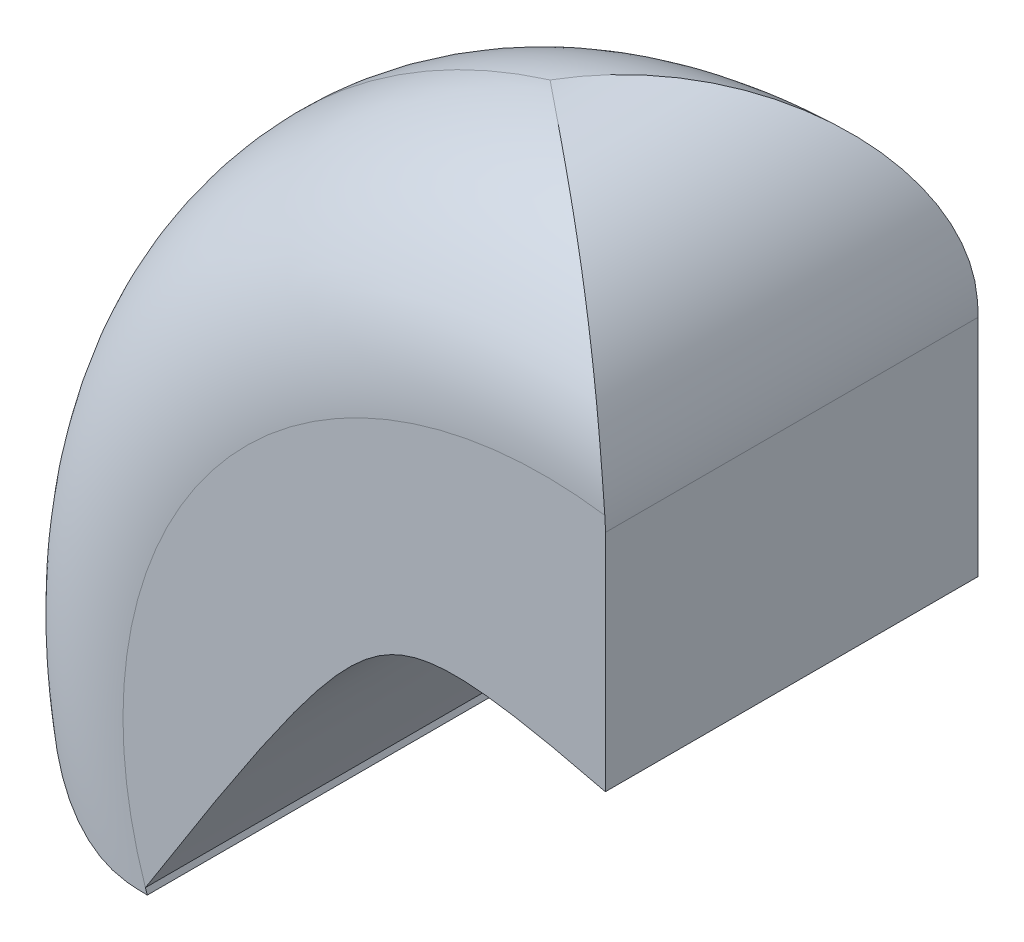
ISO-10303-21;
HEADER;
FILE_DESCRIPTION(('STEP AP214'),'2;1');
FILE_NAME('part.step','',(''),(''),'','','');
FILE_SCHEMA(('AUTOMOTIVE_DESIGN { 1 0 10303 214 1 1 1 1 }'));
ENDSEC;
DATA;
#1=APPLICATION_CONTEXT('core data for automotive mechanical design processes');
#2=APPLICATION_PROTOCOL_DEFINITION('international standard','automotive_design',2000,#1);
#3=PRODUCT_CONTEXT('',#1,'mechanical');
#4=PRODUCT('Part','Part','',(#3));
#5=PRODUCT_RELATED_PRODUCT_CATEGORY('part','',(#4));
#6=PRODUCT_DEFINITION_FORMATION('','',#4);
#7=PRODUCT_DEFINITION_CONTEXT('part definition',#1,'design');
#8=PRODUCT_DEFINITION('design','',#6,#7);
#9=PRODUCT_DEFINITION_SHAPE('','',#8);
#10=(LENGTH_UNIT() NAMED_UNIT(*) SI_UNIT(.MILLI.,.METRE.));
#11=(NAMED_UNIT(*) PLANE_ANGLE_UNIT() SI_UNIT($,.RADIAN.));
#12=(NAMED_UNIT(*) SI_UNIT($,.STERADIAN.) SOLID_ANGLE_UNIT());
#13=UNCERTAINTY_MEASURE_WITH_UNIT(LENGTH_MEASURE(1.E-05),#10,'distance_accuracy_value','');
#14=(GEOMETRIC_REPRESENTATION_CONTEXT(3) GLOBAL_UNCERTAINTY_ASSIGNED_CONTEXT((#13)) GLOBAL_UNIT_ASSIGNED_CONTEXT((#10,
#11,#12)) REPRESENTATION_CONTEXT('',''));
#15=CARTESIAN_POINT('',(0.,0.,0.));
#16=DIRECTION('',(0.,0.,1.));
#17=DIRECTION('',(1.,0.,0.));
#18=AXIS2_PLACEMENT_3D('',#15,#16,#17);
#19=CARTESIAN_POINT('',(0.,0.,4.064));
#20=DIRECTION('',(-1.,0.,0.));
#21=DIRECTION('',(0.,0.,1.));
#22=AXIS2_PLACEMENT_3D('',#19,#20,#21);
#23=PLANE('',#22);
#24=DIRECTION('',(0.,1.,0.));
#25=VECTOR('',#24,1.);
#26=CARTESIAN_POINT('',(0.,0.,4.064));
#27=LINE('',#26,#25);
#28=CARTESIAN_POINT('',(0.,3.47396540392977,4.064));
#29=VERTEX_POINT('',#28);
#30=CARTESIAN_POINT('',(0.,5.92316289736017,4.064));
#31=VERTEX_POINT('',#30);
#32=EDGE_CURVE('E117',#29,#31,#27,.T.);
#33=ORIENTED_EDGE('',*,*,#32,.F.);
#34=DIRECTION('',(0.,0.,-1.));
#35=VECTOR('',#34,1.);
#36=CARTESIAN_POINT('',(0.,3.47396540392977,4.064));
#37=LINE('',#36,#35);
#38=CARTESIAN_POINT('',(0.,3.47396540392977,0.));
#39=VERTEX_POINT('',#38);
#40=EDGE_CURVE('E272',#29,#39,#37,.T.);
#41=ORIENTED_EDGE('',*,*,#40,.T.);
#42=DIRECTION('',(0.,1.,0.));
#43=VECTOR('',#42,1.);
#44=CARTESIAN_POINT('',(0.,0.,0.));
#45=LINE('',#44,#43);
#46=CARTESIAN_POINT('',(0.,5.92316289736017,0.));
#47=VERTEX_POINT('',#46);
#48=EDGE_CURVE('E96',#39,#47,#45,.T.);
#49=ORIENTED_EDGE('',*,*,#48,.T.);
#50=DIRECTION('',(0.,0.,-1.));
#51=VECTOR('',#50,1.);
#52=CARTESIAN_POINT('',(0.,5.92316289736017,4.064));
#53=LINE('',#52,#51);
#54=EDGE_CURVE('E133',#47,#31,#53,.F.);
#55=ORIENTED_EDGE('',*,*,#54,.T.);
#56=EDGE_LOOP('',(#33,#41,#49,#55));
#57=FACE_BOUND('',#56,.T.);
#58=ADVANCED_FACE('F44',(#57),#23,.F.);
#59=CARTESIAN_POINT('',(0.,0.,4.064));
#60=DIRECTION('',(0.,1.,0.));
#61=DIRECTION('',(-1.,0.,0.));
#62=AXIS2_PLACEMENT_3D('',#59,#60,#61);
#63=PLANE('',#62);
#64=CARTESIAN_POINT('',(-5.23453439957361,0.,0.0125687678134763));
#65=CARTESIAN_POINT('',(-5.19484542475579,0.,0.00837410079089449));
#66=CARTESIAN_POINT('',(-5.15510118786411,0.,0.00522936996673769));
#67=CARTESIAN_POINT('',(-5.07550234442881,0.,0.00103978884695762));
#68=CARTESIAN_POINT('',(-5.03564773831422,0.,-5.06960004449771E-06));
#69=CARTESIAN_POINT('',(-4.99573787055482,0.,0.));
#70=B_SPLINE_CURVE_WITH_KNOTS('',3,(#64,#65,#66,#67,#68,#69),.UNSPECIFIED.,.F.,.F.,(4,2,4),(0.,
0.119605364773187,0.239210265256003),.UNSPECIFIED.);
#71=CARTESIAN_POINT('',(-5.23453439957361,0.,0.0125687678134763));
#72=VERTEX_POINT('',#71);
#73=CARTESIAN_POINT('',(-4.99573787055482,0.,0.));
#74=VERTEX_POINT('',#73);
#75=EDGE_CURVE('E122',#72,#74,#70,.T.);
#76=ORIENTED_EDGE('',*,*,#75,.T.);
#77=DIRECTION('',(0.,0.,-1.));
#78=VECTOR('',#77,1.);
#79=CARTESIAN_POINT('',(-4.99573787055482,0.,4.064));
#80=LINE('',#79,#78);
#81=CARTESIAN_POINT('',(-4.99573787055482,0.,4.064));
#82=VERTEX_POINT('',#81);
#83=EDGE_CURVE('E147',#82,#74,#80,.T.);
#84=ORIENTED_EDGE('',*,*,#83,.F.);
#85=CARTESIAN_POINT('',(-4.99573787055482,0.,4.064));
#86=CARTESIAN_POINT('',(-5.03564773831422,0.,4.06400506960005));
#87=CARTESIAN_POINT('',(-5.07550234442881,0.,4.06296021115304));
#88=CARTESIAN_POINT('',(-5.15510118786411,0.,4.05877063003326));
#89=CARTESIAN_POINT('',(-5.19484542475579,0.,4.05562589920911));
#90=CARTESIAN_POINT('',(-5.23453439957361,0.,4.05143123218652));
#91=B_SPLINE_CURVE_WITH_KNOTS('',3,(#85,#86,#87,#88,#89,#90),.UNSPECIFIED.,.F.,.F.,(4,2,4),(0.,
0.119604900482817,0.239210265256003),.UNSPECIFIED.);
#92=CARTESIAN_POINT('',(-5.23453439957361,0.,4.05143123218652));
#93=VERTEX_POINT('',#92);
#94=EDGE_CURVE('E11',#82,#93,#91,.T.);
#95=ORIENTED_EDGE('',*,*,#94,.T.);
#96=DIRECTION('',(0.,0.,-1.));
#97=VECTOR('',#96,1.);
#98=CARTESIAN_POINT('',(-5.23453439957361,0.,4.064));
#99=LINE('',#98,#97);
#100=EDGE_CURVE('E56',#93,#72,#99,.T.);
#101=ORIENTED_EDGE('',*,*,#100,.T.);
#102=EDGE_LOOP('',(#76,#84,#95,#101));
#103=FACE_BOUND('',#102,.T.);
#104=ADVANCED_FACE('F192',(#103),#63,.F.);
#105=CARTESIAN_POINT('',(-0.669630642000845,1.53842681175074,4.064));
#106=DIRECTION('',(0.,0.,-1.));
#107=DIRECTION('',(-1.,0.,0.));
#108=AXIS2_PLACEMENT_3D('',#105,#106,#107);
#109=PLANE('',#108);
#110=CARTESIAN_POINT('',(-0.669630642000845,1.53842681175074,4.064));
#111=DIRECTION('',(0.,0.,-1.));
#112=DIRECTION('',(-1.,0.,0.));
#113=AXIS2_PLACEMENT_3D('',#110,#111,#112);
#114=CIRCLE('',#113,4.59150964368589);
#115=CARTESIAN_POINT('',(-0.00619818509255878,6.08175358661309,4.064));
#116=VERTEX_POINT('',#115);
#117=CARTESIAN_POINT('',(-5.01662393872577,0.0600459114787412,4.064));
#118=VERTEX_POINT('',#117);
#119=EDGE_CURVE('E115',#116,#118,#114,.F.);
#120=ORIENTED_EDGE('',*,*,#119,.T.);
#121=CARTESIAN_POINT('',(-5.01662393872577,0.0600459114787412,4.064));
#122=CARTESIAN_POINT('',(-2.48466830545019,4.09070715051711,4.064));
#123=CARTESIAN_POINT('',(0.,3.47396540392977,4.064));
#124=(BOUNDED_CURVE() B_SPLINE_CURVE(2,(#121,#122,#123),.UNSPECIFIED.,.F.,
.F.) B_SPLINE_CURVE_WITH_KNOTS((3,3),(0.,1.),
.UNSPECIFIED.) CURVE() GEOMETRIC_REPRESENTATION_ITEM() RATIONAL_B_SPLINE_CURVE((1.,3.,1.)) REPRESENTATION_ITEM(''));
#125=EDGE_CURVE('E231',#118,#29,#124,.T.);
#126=ORIENTED_EDGE('',*,*,#125,.T.);
#127=ORIENTED_EDGE('',*,*,#32,.T.);
#128=CARTESIAN_POINT('',(-2.032,5.92316289736017,4.064));
#129=DIRECTION('',(0.,0.,-1.));
#130=DIRECTION('',(-1.,0.,0.));
#131=AXIS2_PLACEMENT_3D('',#128,#129,#130);
#132=CIRCLE('',#131,2.032);
#133=EDGE_CURVE('E110',#31,#116,#132,.F.);
#134=ORIENTED_EDGE('',*,*,#133,.T.);
#135=EDGE_LOOP('',(#120,#126,#127,#134));
#136=FACE_BOUND('',#135,.T.);
#137=ADVANCED_FACE('F112',(#136),#109,.F.);
#138=CARTESIAN_POINT('',(-0.669630642000845,1.53842681175074,0.));
#139=DIRECTION('',(0.,0.,-1.));
#140=DIRECTION('',(-1.,0.,0.));
#141=AXIS2_PLACEMENT_3D('',#138,#139,#140);
#142=PLANE('',#141);
#143=CARTESIAN_POINT('',(-5.01662393872577,0.0600459114787412,0.));
#144=CARTESIAN_POINT('',(-2.48466830545019,4.09070715051711,0.));
#145=CARTESIAN_POINT('',(0.,3.47396540392977,0.));
#146=(BOUNDED_CURVE() B_SPLINE_CURVE(2,(#143,#144,#145),.UNSPECIFIED.,.F.,
.F.) B_SPLINE_CURVE_WITH_KNOTS((3,3),(0.,1.),
.UNSPECIFIED.) CURVE() GEOMETRIC_REPRESENTATION_ITEM() RATIONAL_B_SPLINE_CURVE((1.,3.,1.)) REPRESENTATION_ITEM(''));
#147=CARTESIAN_POINT('',(-5.01662393872577,0.0600459114787183,0.));
#148=VERTEX_POINT('',#147);
#149=EDGE_CURVE('E216',#148,#39,#146,.T.);
#150=ORIENTED_EDGE('',*,*,#149,.F.);
#151=CARTESIAN_POINT('',(-0.669630642000845,1.53842681175074,0.));
#152=DIRECTION('',(0.,0.,-1.));
#153=DIRECTION('',(-1.,0.,0.));
#154=AXIS2_PLACEMENT_3D('',#151,#152,#153);
#155=CIRCLE('',#154,4.59150964368589);
#156=CARTESIAN_POINT('',(-0.00619818509255878,6.08175358661309,0.));
#157=VERTEX_POINT('',#156);
#158=EDGE_CURVE('E189',#148,#157,#155,.T.);
#159=ORIENTED_EDGE('',*,*,#158,.T.);
#160=CARTESIAN_POINT('',(-2.032,5.92316289736017,0.));
#161=DIRECTION('',(0.,0.,-1.));
#162=DIRECTION('',(-1.,0.,0.));
#163=AXIS2_PLACEMENT_3D('',#160,#161,#162);
#164=CIRCLE('',#163,2.032);
#165=EDGE_CURVE('E284',#157,#47,#164,.T.);
#166=ORIENTED_EDGE('',*,*,#165,.T.);
#167=ORIENTED_EDGE('',*,*,#48,.F.);
#168=EDGE_LOOP('',(#150,#159,#166,#167));
#169=FACE_BOUND('',#168,.T.);
#170=ADVANCED_FACE('F196',(#169),#142,.T.);
#171=CARTESIAN_POINT('',(-5.23453439957361,2.032,4.064));
#172=DIRECTION('',(0.,0.,-1.));
#173=DIRECTION('',(-1.,0.,0.));
#174=AXIS2_PLACEMENT_3D('',#171,#172,#173);
#175=CYLINDRICAL_SURFACE('',#174,2.032);
#176=CARTESIAN_POINT('',(-5.23453439957361,0.,0.0125687678134761));
#177=CARTESIAN_POINT('',(-5.28571905375405,-1.02781381491726E-05,0.0179848004909568));
#178=CARTESIAN_POINT('',(-5.33669751565299,0.00193342939825311,0.0250963033013528));
#179=CARTESIAN_POINT('',(-5.43778282880197,0.0095587273480486,0.0424102920684195));
#180=CARTESIAN_POINT('',(-5.48789067112643,0.0152357366853569,0.0526089815196273));
#181=CARTESIAN_POINT('',(-5.58649525657858,0.030096910336612,0.0757165579761269));
#182=CARTESIAN_POINT('',(-5.63500186752818,0.0392518151385274,0.0886024403911041));
#183=CARTESIAN_POINT('',(-5.73053698650695,0.0608564807131713,0.11685026728555));
#184=CARTESIAN_POINT('',(-5.7775650502461,0.0733072214655773,0.132212947680953));
#185=CARTESIAN_POINT('',(-5.91557948265992,0.115128828176905,0.181445196830651));
#186=CARTESIAN_POINT('',(-6.00406599884203,0.149059217704577,0.218597454463782));
#187=CARTESIAN_POINT('',(-6.17304316060148,0.227300029713948,0.299830970944985));
#188=CARTESIAN_POINT('',(-6.25351205217623,0.271637652976631,0.343930285844229));
#189=CARTESIAN_POINT('',(-6.43591417110329,0.388336757640728,0.456176274209942));
#190=CARTESIAN_POINT('',(-6.5336364398264,0.464827253100085,0.526906426592293));
#191=CARTESIAN_POINT('',(-6.71084493228945,0.630472510179892,0.675765734535077));
#192=CARTESIAN_POINT('',(-6.79031840061748,0.71963605986667,0.75390001181189));
#193=CARTESIAN_POINT('',(-6.931708832909,0.908309911268865,0.916368228227954));
#194=CARTESIAN_POINT('',(-6.99340056117709,1.00793284409652,1.00076600126823));
#195=CARTESIAN_POINT('',(-7.09802901879265,1.21362356422638,1.17327776242876));
#196=CARTESIAN_POINT('',(-7.1409533031061,1.31969557509662,1.2613941741154));
#197=CARTESIAN_POINT('',(-7.21608628179891,1.56088581704241,1.46094551749563));
#198=CARTESIAN_POINT('',(-7.24344120101683,1.69699548106517,1.57301442686032));
#199=CARTESIAN_POINT('',(-7.27021954247069,1.97030292297622,1.79871580363267));
#200=CARTESIAN_POINT('',(-7.2696983415095,2.10749800228118,1.9123447228723));
#201=CARTESIAN_POINT('',(-7.25528868747092,2.24550010215223,2.02786872876848));
#202=CARTESIAN_POINT('',(-7.25502650510597,2.24796721369922,2.02993439586857));
#203=CARTESIAN_POINT('',(-7.25475980586102,2.25043376064814,2.032));
#204=B_SPLINE_CURVE_WITH_KNOTS('',3,(#176,#177,#178,#179,#180,#181,#182,#183,#184,#185,#186,
#187,#188,#189,#190,#191,#192,#193,#194,#195,#196,#197,#198,#199,#200,#201,#202,#203),
.UNSPECIFIED.,.F.,.F.,(4,2,2,2,2,2,2,2,2,2,2,2,2,4),(0.,0.154306728037218,0.308424461139787,
0.461273329915595,0.614167697729642,0.918198145591081,1.22303224645508,1.64924162287182,
2.07574800723743,2.50744064818576,2.93941911982263,3.47242395920925,4.00437000686536,
4.01405509566987),.UNSPECIFIED.);
#205=CARTESIAN_POINT('',(-7.25475980586102,2.25043376064814,2.032));
#206=VERTEX_POINT('',#205);
#207=EDGE_CURVE('E140',#72,#206,#204,.T.);
#208=ORIENTED_EDGE('',*,*,#207,.F.);
#209=ORIENTED_EDGE('',*,*,#100,.F.);
#210=CARTESIAN_POINT('',(-5.23453439957361,0.,4.05143123218652));
#211=CARTESIAN_POINT('',(-5.28571905375405,-1.02781381490669E-05,4.04601519950904));
#212=CARTESIAN_POINT('',(-5.33669751565299,0.00193342939825331,4.03890369669865));
#213=CARTESIAN_POINT('',(-5.43778282880197,0.00955872734804887,4.02158970793158));
#214=CARTESIAN_POINT('',(-5.48789067112643,0.0152357366853572,4.01139101848037));
#215=CARTESIAN_POINT('',(-5.58649525657858,0.030096910336612,3.98828344202387));
#216=CARTESIAN_POINT('',(-5.63500186752818,0.0392518151385272,3.9753975596089));
#217=CARTESIAN_POINT('',(-5.73053698650695,0.060856480713171,3.94714973271445));
#218=CARTESIAN_POINT('',(-5.7775650502461,0.0733072214655772,3.93178705231905));
#219=CARTESIAN_POINT('',(-5.91557948265992,0.115128828176905,3.88255480316935));
#220=CARTESIAN_POINT('',(-6.00406599884203,0.149059217704577,3.84540254553622));
#221=CARTESIAN_POINT('',(-6.17304316060148,0.227300029713948,3.76416902905502));
#222=CARTESIAN_POINT('',(-6.25351205217623,0.271637652976631,3.72006971415577));
#223=CARTESIAN_POINT('',(-6.43591417110329,0.388336757640728,3.60782372579006));
#224=CARTESIAN_POINT('',(-6.5336364398264,0.464827253100085,3.53709357340771));
#225=CARTESIAN_POINT('',(-6.71084493228945,0.630472510179892,3.38823426546492));
#226=CARTESIAN_POINT('',(-6.79031840061748,0.71963605986667,3.31009998818811));
#227=CARTESIAN_POINT('',(-6.931708832909,0.908309911268865,3.14763177177205));
#228=CARTESIAN_POINT('',(-6.99340056117709,1.00793284409652,3.06323399873177));
#229=CARTESIAN_POINT('',(-7.09802901879265,1.21362356422638,2.89072223757124));
#230=CARTESIAN_POINT('',(-7.1409533031061,1.31969557509662,2.8026058258846));
#231=CARTESIAN_POINT('',(-7.21608628179891,1.56088581704241,2.60305448250437));
#232=CARTESIAN_POINT('',(-7.24344120101683,1.69699548106517,2.49098557313968));
#233=CARTESIAN_POINT('',(-7.27021954247069,1.97030292297622,2.26528419636733));
#234=CARTESIAN_POINT('',(-7.2696983415095,2.10749800228118,2.15165527712771));
#235=CARTESIAN_POINT('',(-7.25528868747092,2.24550010215223,2.03613127123152));
#236=CARTESIAN_POINT('',(-7.25502650510597,2.24796721369922,2.03406560413143));
#237=CARTESIAN_POINT('',(-7.25475980586102,2.25043376064814,2.032));
#238=B_SPLINE_CURVE_WITH_KNOTS('',3,(#210,#211,#212,#213,#214,#215,#216,#217,#218,#219,#220,
#221,#222,#223,#224,#225,#226,#227,#228,#229,#230,#231,#232,#233,#234,#235,#236,#237),
.UNSPECIFIED.,.F.,.F.,(4,2,2,2,2,2,2,2,2,2,2,2,2,4),(0.,0.154306728037218,0.308424461139786,
0.461273329915593,0.614167697729642,0.918198145591081,1.22303224645508,1.64924162287182,
2.07574800723743,2.50744064818576,2.93941911982263,3.47242395920925,4.00437000686536,
4.01405509566987),.UNSPECIFIED.);
#239=EDGE_CURVE('E87',#206,#93,#238,.F.);
#240=ORIENTED_EDGE('',*,*,#239,.F.);
#241=EDGE_LOOP('',(#208,#209,#240));
#242=FACE_BOUND('',#241,.T.);
#243=ADVANCED_FACE('F46',(#242),#175,.T.);
#244=CARTESIAN_POINT('',(-0.669630642000845,1.53842681175074,2.032));
#245=DIRECTION('',(0.,0.,-1.));
#246=DIRECTION('',(-1.,0.,0.));
#247=AXIS2_PLACEMENT_3D('',#244,#245,#246);
#248=TOROIDAL_SURFACE('',#247,4.59150964368589,2.032);
#249=CARTESIAN_POINT('',(-0.669630642000845,1.53842681175074,2.032));
#250=DIRECTION('',(0.,0.,-1.));
#251=DIRECTION('',(-1.,0.,0.));
#252=AXIS2_PLACEMENT_3D('',#249,#250,#251);
#253=CIRCLE('',#252,6.62350964368589);
#254=CARTESIAN_POINT('',(-2.63492469150342,7.86365402498109,2.032));
#255=VERTEX_POINT('',#254);
#256=EDGE_CURVE('E145',#206,#255,#253,.T.);
#257=ORIENTED_EDGE('',*,*,#256,.F.);
#258=ORIENTED_EDGE('',*,*,#239,.T.);
#259=ORIENTED_EDGE('',*,*,#94,.F.);
#260=CARTESIAN_POINT('',(-4.99573787055482,0.,4.064));
#261=CARTESIAN_POINT('',(-4.99662543054821,0.00249584813689046,4.064));
#262=CARTESIAN_POINT('',(-4.9975108306537,0.00499246436140658,4.064));
#263=CARTESIAN_POINT('',(-4.9992773084468,0.00998722550320205,4.064));
#264=CARTESIAN_POINT('',(-5.00015838613441,0.0124853704204814,4.064));
#265=CARTESIAN_POINT('',(-5.00191621644963,0.0174831814653261,4.064));
#266=CARTESIAN_POINT('',(-5.00279296907725,0.0199828475928914,4.064));
#267=CARTESIAN_POINT('',(-5.00454214664684,0.0249836935700356,4.064));
#268=CARTESIAN_POINT('',(-5.00541457158882,0.0274848734196145,4.064));
#269=CARTESIAN_POINT('',(-5.00715509117345,0.0324887393483347,4.064));
#270=CARTESIAN_POINT('',(-5.0080231858161,0.0349914254274761,4.064));
#271=CARTESIAN_POINT('',(-5.00975504220185,0.0399982963181843,4.064));
#272=CARTESIAN_POINT('',(-5.01061880394496,0.0425024811297511,4.064));
#273=CARTESIAN_POINT('',(-5.01234199194339,0.0475123419840225,4.064));
#274=CARTESIAN_POINT('',(-5.01320141819871,0.050018018026727,4.064));
#275=CARTESIAN_POINT('',(-5.01491593264983,0.0550308538363273,4.064));
#276=CARTESIAN_POINT('',(-5.01577102084562,0.057538013603223,4.064));
#277=CARTESIAN_POINT('',(-5.01662393872577,0.0600459114787389,4.064));
#278=B_SPLINE_CURVE_WITH_KNOTS('',3,(#260,#261,#262,#263,#264,#265,#266,#267,#268,#269,#270,
#271,#272,#273,#274,#275,#276,#277),.UNSPECIFIED.,.F.,.F.,(4,2,2,2,2,2,2,2,4),(0.,
0.00794689689208011,0.0158937937841561,0.0238406906762363,0.0317875875683123,0.0397344844603881,
0.0476813813524683,0.0556282782445443,0.0635751751366246),.UNSPECIFIED.);
#279=EDGE_CURVE('E131',#82,#118,#278,.T.);
#280=ORIENTED_EDGE('',*,*,#279,.T.);
#281=ORIENTED_EDGE('',*,*,#119,.F.);
#282=CARTESIAN_POINT('',(-0.00619818509255874,6.08175358661309,4.064));
#283=CARTESIAN_POINT('',(-0.00992303264472816,6.1294796954283,4.06400700110048));
#284=CARTESIAN_POINT('',(-0.0153553011937033,6.17705484500221,4.06239133474796));
#285=CARTESIAN_POINT('',(-0.0295080417564255,6.27146407390049,4.05611562111044));
#286=CARTESIAN_POINT('',(-0.0382252340318806,6.31829884399815,4.05145860698382));
#287=CARTESIAN_POINT('',(-0.0587478916395422,6.41051993754906,4.0393482848057));
#288=CARTESIAN_POINT('',(-0.0705284768707971,6.45591476729407,4.03191730358988));
#289=CARTESIAN_POINT('',(-0.0970289496924171,6.5453271599716,4.01448329819233));
#290=CARTESIAN_POINT('',(-0.11174949201376,6.58934441358648,4.00447970094378));
#291=CARTESIAN_POINT('',(-0.159904642709455,6.71858254184367,3.97103927652186));
#292=CARTESIAN_POINT('',(-0.197432910694437,6.80142875770132,3.94411153708592));
#293=CARTESIAN_POINT('',(-0.281728870157649,6.95932413450599,3.88266736369619));
#294=CARTESIAN_POINT('',(-0.328517680794534,7.03435486352234,3.8481335630229));
#295=CARTESIAN_POINT('',(-0.447740795197633,7.20107233257596,3.75956906785135));
#296=CARTESIAN_POINT('',(-0.523365271078276,7.28913278635171,3.70298066491692));
#297=CARTESIAN_POINT('',(-0.684823393585903,7.44863516101092,3.5816529925139));
#298=CARTESIAN_POINT('',(-0.770669757074355,7.52005604750329,3.51690356408141));
#299=CARTESIAN_POINT('',(-0.970976111962141,7.66145330679835,3.36518741533322));
#300=CARTESIAN_POINT('',(-1.08736188733371,7.72697842461445,3.27661581533203));
#301=CARTESIAN_POINT('',(-1.32637117582217,7.83320184840712,3.09330687128316));
#302=CARTESIAN_POINT('',(-1.44899998729371,7.87387867232881,2.99856427030368));
#303=CARTESIAN_POINT('',(-1.69795163219184,7.93162886399486,2.80398583962987));
#304=CARTESIAN_POINT('',(-1.82430031463819,7.94843636305691,2.70410528781578));
#305=CARTESIAN_POINT('',(-2.07575211788655,7.95858114707276,2.50204062908236));
#306=CARTESIAN_POINT('',(-2.20085664250549,7.95194886678807,2.39985968031898));
#307=CARTESIAN_POINT('',(-2.42697273050828,7.91912542176043,2.2110562378593));
#308=CARTESIAN_POINT('',(-2.52860480243203,7.89627593994814,2.12459417263937));
#309=CARTESIAN_POINT('',(-2.63018485340828,7.865121972909,2.0361312908184));
#310=CARTESIAN_POINT('',(-2.6325554718751,7.86439016258017,2.03406562383239));
#311=CARTESIAN_POINT('',(-2.63492469150342,7.86365402498109,2.032));
#312=B_SPLINE_CURVE_WITH_KNOTS('',3,(#282,#283,#284,#285,#286,#287,#288,#289,#290,#291,#292,
#293,#294,#295,#296,#297,#298,#299,#300,#301,#302,#303,#304,#305,#306,#307,#308,#309,#310,#311),
.UNSPECIFIED.,.F.,.F.,(4,2,2,2,2,2,2,2,2,2,2,2,2,2,4),(0.,0.143529826631492,0.286916728065046,
0.429173597560637,0.571462183181185,0.85469363602884,1.138578614536,1.52388654974893,
1.90967894872374,2.38796135483375,2.86665666661703,3.35064319777457,3.83400154042635,
4.23907618164812,4.24876127045262),.UNSPECIFIED.);
#313=EDGE_CURVE('E128',#255,#116,#312,.F.);
#314=ORIENTED_EDGE('',*,*,#313,.F.);
#315=EDGE_LOOP('',(#257,#258,#259,#280,#281,#314));
#316=FACE_BOUND('',#315,.T.);
#317=ADVANCED_FACE('F127',(#316),#248,.T.);
#318=CARTESIAN_POINT('',(-0.669630642000845,1.53842681175074,2.032));
#319=DIRECTION('',(0.,0.,-1.));
#320=DIRECTION('',(-1.,0.,0.));
#321=AXIS2_PLACEMENT_3D('',#318,#319,#320);
#322=TOROIDAL_SURFACE('',#321,4.59150964368589,2.032);
#323=ORIENTED_EDGE('',*,*,#207,.T.);
#324=ORIENTED_EDGE('',*,*,#256,.T.);
#325=CARTESIAN_POINT('',(-0.00619818509255874,6.08175358661309,0.));
#326=CARTESIAN_POINT('',(-0.00992303264472839,6.1294796954283,-7.00110048105808E-06));
#327=CARTESIAN_POINT('',(-0.0153553011937033,6.17705484500221,0.00160866525204433));
#328=CARTESIAN_POINT('',(-0.0295080417564251,6.27146407390049,0.00788437888955926));
#329=CARTESIAN_POINT('',(-0.0382252340318799,6.31829884399814,0.0125413930161854));
#330=CARTESIAN_POINT('',(-0.0587478916395414,6.41051993754906,0.0246517151943001));
#331=CARTESIAN_POINT('',(-0.0705284768707965,6.45591476729407,0.0320826964101174));
#332=CARTESIAN_POINT('',(-0.0970289496924171,6.5453271599716,0.0495167018076707));
#333=CARTESIAN_POINT('',(-0.11174949201376,6.58934441358648,0.05952029905622));
#334=CARTESIAN_POINT('',(-0.159904642709455,6.71858254184367,0.0929607234781366));
#335=CARTESIAN_POINT('',(-0.197432910694437,6.80142875770132,0.119888462914082));
#336=CARTESIAN_POINT('',(-0.281728870157649,6.95932413450599,0.181332636303809));
#337=CARTESIAN_POINT('',(-0.328517680794534,7.03435486352234,0.2158664369771));
#338=CARTESIAN_POINT('',(-0.447740795197632,7.20107233257596,0.304430932148652));
#339=CARTESIAN_POINT('',(-0.523365271078273,7.2891327863517,0.361019335083079));
#340=CARTESIAN_POINT('',(-0.6848233935859,7.44863516101092,0.482347007486099));
#341=CARTESIAN_POINT('',(-0.770669757074355,7.52005604750328,0.547096435918584));
#342=CARTESIAN_POINT('',(-0.970976111962141,7.66145330679835,0.698812584666783));
#343=CARTESIAN_POINT('',(-1.0873618873337,7.72697842461446,0.787384184667991));
#344=CARTESIAN_POINT('',(-1.32637117582218,7.83320184840712,0.970693128716831));
#345=CARTESIAN_POINT('',(-1.44899998729375,7.8738786723288,1.06543572969627));
#346=CARTESIAN_POINT('',(-1.69795163219179,7.93162886399487,1.26001416037019));
#347=CARTESIAN_POINT('',(-1.82430031463802,7.94843636305696,1.35989471218442));
#348=CARTESIAN_POINT('',(-2.07575211788671,7.95858114707271,1.56195937091743));
#349=CARTESIAN_POINT('',(-2.2008566425061,7.95194886678788,1.66414031968026));
#350=CARTESIAN_POINT('',(-2.42697273050776,7.91912542176059,1.85294376214135));
#351=CARTESIAN_POINT('',(-2.52860480243026,7.89627593994869,1.93940582736286));
#352=CARTESIAN_POINT('',(-2.6301848534082,7.86512197290902,2.02786870918171));
#353=CARTESIAN_POINT('',(-2.63255547187505,7.86439016258019,2.02993437616767));
#354=CARTESIAN_POINT('',(-2.63492469150342,7.86365402498109,2.032));
#355=B_SPLINE_CURVE_WITH_KNOTS('',3,(#325,#326,#327,#328,#329,#330,#331,#332,#333,#334,#335,
#336,#337,#338,#339,#340,#341,#342,#343,#344,#345,#346,#347,#348,#349,#350,#351,#352,#353,#354),
.UNSPECIFIED.,.F.,.F.,(4,2,2,2,2,2,2,2,2,2,2,2,2,2,4),(0.,0.14352982663149,0.286916728065043,
0.429173597560636,0.571462183181185,0.854693636028841,1.138578614536,1.52388654974892,
1.90967894872374,2.38796135483376,2.86665666661703,3.35064319777456,3.83400154042635,
4.23907618164812,4.24876127045262),.UNSPECIFIED.);
#356=EDGE_CURVE('E138',#157,#255,#355,.T.);
#357=ORIENTED_EDGE('',*,*,#356,.F.);
#358=ORIENTED_EDGE('',*,*,#158,.F.);
#359=CARTESIAN_POINT('',(-4.99573787055482,0.,0.));
#360=DIRECTION('',(-0.32852811437326,0.944494191653051,0.));
#361=VECTOR('',#360,1.);
#362=LINE('',#359,#361);
#363=EDGE_CURVE('E64',#74,#148,#362,.T.);
#364=ORIENTED_EDGE('',*,*,#363,.F.);
#365=ORIENTED_EDGE('',*,*,#75,.F.);
#366=EDGE_LOOP('',(#323,#324,#357,#358,#364,#365));
#367=FACE_BOUND('',#366,.T.);
#368=ADVANCED_FACE('F170',(#367),#322,.T.);
#369=CARTESIAN_POINT('',(-2.032,5.92316289736017,4.064));
#370=DIRECTION('',(0.,0.,-1.));
#371=DIRECTION('',(-1.,0.,0.));
#372=AXIS2_PLACEMENT_3D('',#369,#370,#371);
#373=CYLINDRICAL_SURFACE('',#372,2.032);
#374=ORIENTED_EDGE('',*,*,#133,.F.);
#375=ORIENTED_EDGE('',*,*,#54,.F.);
#376=ORIENTED_EDGE('',*,*,#165,.F.);
#377=ORIENTED_EDGE('',*,*,#356,.T.);
#378=ORIENTED_EDGE('',*,*,#313,.T.);
#379=EDGE_LOOP('',(#374,#375,#376,#377,#378));
#380=FACE_BOUND('',#379,.T.);
#381=ADVANCED_FACE('F135',(#380),#373,.T.);
#382=CARTESIAN_POINT('',(-4.99573787055482,0.,4.064));
#383=DIRECTION('',(-0.944494191653051,-0.32852811437326,0.));
#384=DIRECTION('',(0.32852811437326,-0.944494191653051,0.));
#385=AXIS2_PLACEMENT_3D('',#382,#383,#384);
#386=PLANE('',#385);
#387=ORIENTED_EDGE('',*,*,#363,.T.);
#388=DIRECTION('',(0.,0.,-1.));
#389=VECTOR('',#388,1.);
#390=CARTESIAN_POINT('',(-5.01662393872577,0.0600459114787412,4.064));
#391=LINE('',#390,#389);
#392=EDGE_CURVE('E274',#118,#148,#391,.T.);
#393=ORIENTED_EDGE('',*,*,#392,.F.);
#394=ORIENTED_EDGE('',*,*,#279,.F.);
#395=ORIENTED_EDGE('',*,*,#83,.T.);
#396=EDGE_LOOP('',(#387,#393,#394,#395));
#397=FACE_BOUND('',#396,.T.);
#398=ADVANCED_FACE('F169',(#397),#386,.F.);
#399=DIRECTION('',(0.,0.,-1.));
#400=VECTOR('',#399,1.);
#401=SURFACE_OF_LINEAR_EXTRUSION('',#124,#400);
#402=ORIENTED_EDGE('',*,*,#149,.T.);
#403=ORIENTED_EDGE('',*,*,#40,.F.);
#404=ORIENTED_EDGE('',*,*,#125,.F.);
#405=ORIENTED_EDGE('',*,*,#392,.T.);
#406=EDGE_LOOP('',(#402,#403,#404,#405));
#407=FACE_BOUND('',#406,.T.);
#408=ADVANCED_FACE('F258',(#407),#401,.F.);
#409=CLOSED_SHELL('',(#58,#104,#137,#170,#243,#317,#368,#381,#398,#408));
#410=MANIFOLD_SOLID_BREP('B2',#409);
#411=ADVANCED_BREP_SHAPE_REPRESENTATION('',(#18,#410),#14);
#412=SHAPE_DEFINITION_REPRESENTATION(#9,#411);
ENDSEC;
END-ISO-10303-21;
